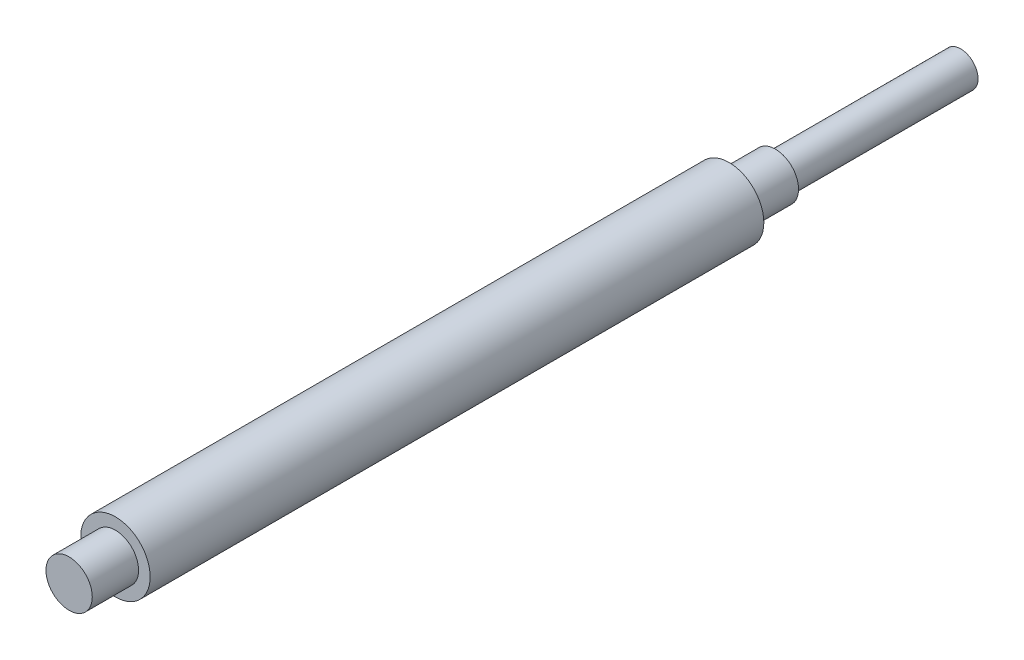
ISO-10303-21;
HEADER;
FILE_DESCRIPTION(('STEP AP214'),'2;1');
FILE_NAME('part.step','',(''),(''),'','','');
FILE_SCHEMA(('AUTOMOTIVE_DESIGN { 1 0 10303 214 1 1 1 1 }'));
ENDSEC;
DATA;
#1=APPLICATION_CONTEXT('core data for automotive mechanical design processes');
#2=APPLICATION_PROTOCOL_DEFINITION('international standard','automotive_design',2000,#1);
#3=PRODUCT_CONTEXT('',#1,'mechanical');
#4=PRODUCT('Part','Part','',(#3));
#5=PRODUCT_RELATED_PRODUCT_CATEGORY('part','',(#4));
#6=PRODUCT_DEFINITION_FORMATION('','',#4);
#7=PRODUCT_DEFINITION_CONTEXT('part definition',#1,'design');
#8=PRODUCT_DEFINITION('design','',#6,#7);
#9=PRODUCT_DEFINITION_SHAPE('','',#8);
#10=(LENGTH_UNIT() NAMED_UNIT(*) SI_UNIT(.MILLI.,.METRE.));
#11=(NAMED_UNIT(*) PLANE_ANGLE_UNIT() SI_UNIT($,.RADIAN.));
#12=(NAMED_UNIT(*) SI_UNIT($,.STERADIAN.) SOLID_ANGLE_UNIT());
#13=UNCERTAINTY_MEASURE_WITH_UNIT(LENGTH_MEASURE(1.E-05),#10,'distance_accuracy_value','');
#14=(GEOMETRIC_REPRESENTATION_CONTEXT(3) GLOBAL_UNCERTAINTY_ASSIGNED_CONTEXT((#13)) GLOBAL_UNIT_ASSIGNED_CONTEXT((#10,
#11,#12)) REPRESENTATION_CONTEXT('',''));
#15=CARTESIAN_POINT('',(0.,0.,0.));
#16=DIRECTION('',(0.,0.,1.));
#17=DIRECTION('',(1.,0.,0.));
#18=AXIS2_PLACEMENT_3D('',#15,#16,#17);
#19=CARTESIAN_POINT('',(0.,0.,77.));
#20=DIRECTION('',(0.,0.,-1.));
#21=DIRECTION('',(-1.,0.,0.));
#22=AXIS2_PLACEMENT_3D('',#19,#20,#21);
#23=CYLINDRICAL_SURFACE('',#22,3.);
#24=CARTESIAN_POINT('',(0.,0.,20.));
#25=DIRECTION('',(0.,0.,1.));
#26=DIRECTION('',(1.,0.,0.));
#27=AXIS2_PLACEMENT_3D('',#24,#25,#26);
#28=CIRCLE('',#27,3.);
#29=CARTESIAN_POINT('',(3.,0.,20.));
#30=VERTEX_POINT('',#29);
#31=EDGE_CURVE('E60',#30,#30,#28,.F.);
#32=ORIENTED_EDGE('',*,*,#31,.F.);
#33=EDGE_LOOP('',(#32));
#34=FACE_BOUND('',#33,.T.);
#35=CARTESIAN_POINT('',(0.,0.,73.));
#36=DIRECTION('',(0.,0.,1.));
#37=DIRECTION('',(1.,0.,0.));
#38=AXIS2_PLACEMENT_3D('',#35,#36,#37);
#39=CIRCLE('',#38,3.);
#40=CARTESIAN_POINT('',(3.,0.,73.));
#41=VERTEX_POINT('',#40);
#42=EDGE_CURVE('E12',#41,#41,#39,.T.);
#43=ORIENTED_EDGE('',*,*,#42,.F.);
#44=EDGE_LOOP('',(#43));
#45=FACE_BOUND('',#44,.T.);
#46=ADVANCED_FACE('F40',(#34,#45),#23,.T.);
#47=CARTESIAN_POINT('',(0.,0.,73.));
#48=DIRECTION('',(0.,0.,1.));
#49=DIRECTION('',(1.,0.,0.));
#50=AXIS2_PLACEMENT_3D('',#47,#48,#49);
#51=PLANE('',#50);
#52=CARTESIAN_POINT('',(0.,0.,73.));
#53=DIRECTION('',(0.,0.,1.));
#54=DIRECTION('',(1.,0.,0.));
#55=AXIS2_PLACEMENT_3D('',#52,#53,#54);
#56=CIRCLE('',#55,2.);
#57=CARTESIAN_POINT('',(2.,0.,73.));
#58=VERTEX_POINT('',#57);
#59=EDGE_CURVE('E48',#58,#58,#56,.T.);
#60=ORIENTED_EDGE('',*,*,#59,.F.);
#61=EDGE_LOOP('',(#60));
#62=FACE_BOUND('',#61,.T.);
#63=ORIENTED_EDGE('',*,*,#42,.T.);
#64=EDGE_LOOP('',(#63));
#65=FACE_BOUND('',#64,.T.);
#66=ADVANCED_FACE('F95',(#62,#65),#51,.T.);
#67=CARTESIAN_POINT('',(0.,0.,73.));
#68=DIRECTION('',(0.,0.,1.));
#69=DIRECTION('',(1.,0.,0.));
#70=AXIS2_PLACEMENT_3D('',#67,#68,#69);
#71=CYLINDRICAL_SURFACE('',#70,2.);
#72=ORIENTED_EDGE('',*,*,#59,.T.);
#73=EDGE_LOOP('',(#72));
#74=FACE_BOUND('',#73,.T.);
#75=CARTESIAN_POINT('',(0.,0.,77.));
#76=DIRECTION('',(0.,0.,1.));
#77=DIRECTION('',(1.,0.,0.));
#78=AXIS2_PLACEMENT_3D('',#75,#76,#77);
#79=CIRCLE('',#78,2.);
#80=CARTESIAN_POINT('',(2.,0.,77.));
#81=VERTEX_POINT('',#80);
#82=EDGE_CURVE('E53',#81,#81,#79,.T.);
#83=ORIENTED_EDGE('',*,*,#82,.F.);
#84=EDGE_LOOP('',(#83));
#85=FACE_BOUND('',#84,.T.);
#86=ADVANCED_FACE('F100',(#74,#85),#71,.T.);
#87=CARTESIAN_POINT('',(0.,0.,77.));
#88=DIRECTION('',(0.,0.,1.));
#89=DIRECTION('',(1.,0.,0.));
#90=AXIS2_PLACEMENT_3D('',#87,#88,#89);
#91=PLANE('',#90);
#92=ORIENTED_EDGE('',*,*,#82,.T.);
#93=EDGE_LOOP('',(#92));
#94=FACE_BOUND('',#93,.T.);
#95=ADVANCED_FACE('F113',(#94),#91,.T.);
#96=CARTESIAN_POINT('',(0.,0.,81.4852813742386));
#97=DIRECTION('',(0.,0.,-1.));
#98=DIRECTION('',(-1.,0.,0.));
#99=AXIS2_PLACEMENT_3D('',#96,#97,#98);
#100=CYLINDRICAL_SURFACE('',#99,2.);
#101=CARTESIAN_POINT('',(0.,0.,16.));
#102=DIRECTION('',(0.,0.,1.));
#103=DIRECTION('',(1.,0.,0.));
#104=AXIS2_PLACEMENT_3D('',#101,#102,#103);
#105=CIRCLE('',#104,2.);
#106=CARTESIAN_POINT('',(2.,0.,16.));
#107=VERTEX_POINT('',#106);
#108=EDGE_CURVE('E43',#107,#107,#105,.F.);
#109=ORIENTED_EDGE('',*,*,#108,.F.);
#110=EDGE_LOOP('',(#109));
#111=FACE_BOUND('',#110,.T.);
#112=CARTESIAN_POINT('',(0.,0.,20.));
#113=DIRECTION('',(0.,0.,1.));
#114=DIRECTION('',(1.,0.,0.));
#115=AXIS2_PLACEMENT_3D('',#112,#113,#114);
#116=CIRCLE('',#115,2.);
#117=CARTESIAN_POINT('',(2.,0.,20.));
#118=VERTEX_POINT('',#117);
#119=EDGE_CURVE('E58',#118,#118,#116,.F.);
#120=ORIENTED_EDGE('',*,*,#119,.T.);
#121=EDGE_LOOP('',(#120));
#122=FACE_BOUND('',#121,.T.);
#123=ADVANCED_FACE('F108',(#111,#122),#100,.T.);
#124=CARTESIAN_POINT('',(0.,0.,20.));
#125=DIRECTION('',(0.,0.,1.));
#126=DIRECTION('',(1.,0.,0.));
#127=AXIS2_PLACEMENT_3D('',#124,#125,#126);
#128=PLANE('',#127);
#129=ORIENTED_EDGE('',*,*,#31,.T.);
#130=EDGE_LOOP('',(#129));
#131=FACE_BOUND('',#130,.T.);
#132=ORIENTED_EDGE('',*,*,#119,.F.);
#133=EDGE_LOOP('',(#132));
#134=FACE_BOUND('',#133,.T.);
#135=ADVANCED_FACE('F82',(#131,#134),#128,.F.);
#136=CARTESIAN_POINT('',(0.,0.,27.0710678118655));
#137=DIRECTION('',(0.,0.,-1.));
#138=DIRECTION('',(-1.,0.,0.));
#139=AXIS2_PLACEMENT_3D('',#136,#137,#138);
#140=CYLINDRICAL_SURFACE('',#139,1.5);
#141=CARTESIAN_POINT('',(0.,0.,0.));
#142=DIRECTION('',(0.,0.,-1.));
#143=DIRECTION('',(-1.,0.,0.));
#144=AXIS2_PLACEMENT_3D('',#141,#142,#143);
#145=CIRCLE('',#144,1.5);
#146=CARTESIAN_POINT('',(-1.5,0.,0.));
#147=VERTEX_POINT('',#146);
#148=EDGE_CURVE('E71',#147,#147,#145,.T.);
#149=CARTESIAN_POINT('',(0.,0.,16.));
#150=DIRECTION('',(0.,0.,1.));
#151=DIRECTION('',(1.,0.,0.));
#152=AXIS2_PLACEMENT_3D('',#149,#150,#151);
#153=CIRCLE('',#152,1.5);
#154=CARTESIAN_POINT('',(-1.5,0.,16.));
#155=VERTEX_POINT('',#154);
#156=EDGE_CURVE('E67',#155,#155,#153,.F.);
#157=CARTESIAN_POINT('',(-1.5,0.,0.));
#158=CARTESIAN_POINT('',(-1.5,0.,0.16666666666667));
#159=CARTESIAN_POINT('',(-1.5,0.,0.333333333333337));
#160=CARTESIAN_POINT('',(-1.5,0.,0.666666666666671));
#161=CARTESIAN_POINT('',(-1.5,0.,0.833333333333338));
#162=CARTESIAN_POINT('',(-1.5,0.,1.16666666666667));
#163=CARTESIAN_POINT('',(-1.5,0.,1.33333333333334));
#164=CARTESIAN_POINT('',(-1.5,0.,1.66666666666667));
#165=CARTESIAN_POINT('',(-1.5,0.,1.83333333333334));
#166=CARTESIAN_POINT('',(-1.5,0.,2.16666666666667));
#167=CARTESIAN_POINT('',(-1.5,0.,2.33333333333334));
#168=CARTESIAN_POINT('',(-1.5,0.,2.66666666666667));
#169=CARTESIAN_POINT('',(-1.5,0.,2.83333333333334));
#170=CARTESIAN_POINT('',(-1.5,0.,3.16666666666667));
#171=CARTESIAN_POINT('',(-1.5,0.,3.33333333333334));
#172=CARTESIAN_POINT('',(-1.5,0.,3.66666666666667));
#173=CARTESIAN_POINT('',(-1.5,0.,3.83333333333333));
#174=CARTESIAN_POINT('',(-1.5,0.,4.16666666666667));
#175=CARTESIAN_POINT('',(-1.5,0.,4.33333333333333));
#176=CARTESIAN_POINT('',(-1.5,0.,4.66666666666667));
#177=CARTESIAN_POINT('',(-1.5,0.,4.83333333333333));
#178=CARTESIAN_POINT('',(-1.5,0.,5.16666666666667));
#179=CARTESIAN_POINT('',(-1.5,0.,5.33333333333333));
#180=CARTESIAN_POINT('',(-1.5,0.,5.66666666666667));
#181=CARTESIAN_POINT('',(-1.5,0.,5.83333333333334));
#182=CARTESIAN_POINT('',(-1.5,0.,6.16666666666667));
#183=CARTESIAN_POINT('',(-1.5,0.,6.33333333333334));
#184=CARTESIAN_POINT('',(-1.5,0.,6.66666666666667));
#185=CARTESIAN_POINT('',(-1.5,0.,6.83333333333334));
#186=CARTESIAN_POINT('',(-1.5,0.,7.16666666666667));
#187=CARTESIAN_POINT('',(-1.5,0.,7.33333333333333));
#188=CARTESIAN_POINT('',(-1.5,0.,7.66666666666667));
#189=CARTESIAN_POINT('',(-1.5,0.,7.83333333333333));
#190=CARTESIAN_POINT('',(-1.5,0.,8.16666666666667));
#191=CARTESIAN_POINT('',(-1.5,0.,8.33333333333333));
#192=CARTESIAN_POINT('',(-1.5,0.,8.66666666666667));
#193=CARTESIAN_POINT('',(-1.5,0.,8.83333333333333));
#194=CARTESIAN_POINT('',(-1.5,0.,9.16666666666666));
#195=CARTESIAN_POINT('',(-1.5,0.,9.33333333333333));
#196=CARTESIAN_POINT('',(-1.5,0.,9.66666666666667));
#197=CARTESIAN_POINT('',(-1.5,0.,9.83333333333333));
#198=CARTESIAN_POINT('',(-1.5,0.,10.1666666666667));
#199=CARTESIAN_POINT('',(-1.5,0.,10.3333333333333));
#200=CARTESIAN_POINT('',(-1.5,0.,10.6666666666667));
#201=CARTESIAN_POINT('',(-1.5,0.,10.8333333333333));
#202=CARTESIAN_POINT('',(-1.5,0.,11.1666666666667));
#203=CARTESIAN_POINT('',(-1.5,0.,11.3333333333333));
#204=CARTESIAN_POINT('',(-1.5,0.,11.6666666666667));
#205=CARTESIAN_POINT('',(-1.5,0.,11.8333333333333));
#206=CARTESIAN_POINT('',(-1.5,0.,12.1666666666667));
#207=CARTESIAN_POINT('',(-1.5,0.,12.3333333333333));
#208=CARTESIAN_POINT('',(-1.5,0.,12.6666666666667));
#209=CARTESIAN_POINT('',(-1.5,0.,12.8333333333333));
#210=CARTESIAN_POINT('',(-1.5,0.,13.1666666666667));
#211=CARTESIAN_POINT('',(-1.5,0.,13.3333333333333));
#212=CARTESIAN_POINT('',(-1.5,0.,13.6666666666667));
#213=CARTESIAN_POINT('',(-1.5,0.,13.8333333333333));
#214=CARTESIAN_POINT('',(-1.5,0.,14.1666666666667));
#215=CARTESIAN_POINT('',(-1.5,0.,14.3333333333333));
#216=CARTESIAN_POINT('',(-1.5,0.,14.6666666666667));
#217=CARTESIAN_POINT('',(-1.5,0.,14.8333333333333));
#218=CARTESIAN_POINT('',(-1.5,0.,15.1666666666667));
#219=CARTESIAN_POINT('',(-1.5,0.,15.3333333333333));
#220=CARTESIAN_POINT('',(-1.5,0.,15.6666666666667));
#221=CARTESIAN_POINT('',(-1.5,0.,15.8333333333333));
#222=CARTESIAN_POINT('',(-1.5,0.,16.));
#223=B_SPLINE_CURVE_WITH_KNOTS('',3,(#157,#158,#159,#160,#161,#162,#163,#164,#165,#166,#167,
#168,#169,#170,#171,#172,#173,#174,#175,#176,#177,#178,#179,#180,#181,#182,#183,#184,#185,#186,
#187,#188,#189,#190,#191,#192,#193,#194,#195,#196,#197,#198,#199,#200,#201,#202,#203,#204,#205,
#206,#207,#208,#209,#210,#211,#212,#213,#214,#215,#216,#217,#218,#219,#220,#221,#222),
.UNSPECIFIED.,.F.,.F.,(4,2,2,2,2,2,2,2,2,2,2,2,2,2,2,2,2,2,2,2,2,2,2,2,2,2,2,2,2,2,2,2,4),(0.,
0.5,1.,1.5,2.,2.5,3.,3.5,4.,4.5,5.,5.5,6.,6.5,7.,7.5,8.,8.5,8.99999999999999,9.49999999999999,
9.99999999999999,10.5,11.,11.5,12.,12.5,13.,13.5,14.,14.5,15.,15.5,16.),.UNSPECIFIED.);
#224=EDGE_CURVE('BSEAM78',#147,#155,#223,.T.);
#225=ORIENTED_EDGE('',*,*,#148,.F.);
#226=ORIENTED_EDGE('',*,*,#156,.T.);
#227=ORIENTED_EDGE('',*,*,#224,.T.);
#228=ORIENTED_EDGE('',*,*,#224,.F.);
#229=EDGE_LOOP('',(#225,#227,#226,#228));
#230=FACE_BOUND('',#229,.T.);
#231=ADVANCED_FACE('F78',(#230),#140,.T.);
#232=CARTESIAN_POINT('',(0.,0.,16.));
#233=DIRECTION('',(0.,0.,1.));
#234=DIRECTION('',(1.,0.,0.));
#235=AXIS2_PLACEMENT_3D('',#232,#233,#234);
#236=PLANE('',#235);
#237=ORIENTED_EDGE('',*,*,#108,.T.);
#238=EDGE_LOOP('',(#237));
#239=FACE_BOUND('',#238,.T.);
#240=ORIENTED_EDGE('',*,*,#156,.F.);
#241=EDGE_LOOP('',(#240));
#242=FACE_BOUND('',#241,.T.);
#243=ADVANCED_FACE('F81',(#239,#242),#236,.F.);
#244=CARTESIAN_POINT('',(0.,0.,0.));
#245=DIRECTION('',(0.,0.,1.));
#246=DIRECTION('',(1.,0.,0.));
#247=AXIS2_PLACEMENT_3D('',#244,#245,#246);
#248=PLANE('',#247);
#249=ORIENTED_EDGE('',*,*,#148,.T.);
#250=EDGE_LOOP('',(#249));
#251=FACE_BOUND('',#250,.T.);
#252=ADVANCED_FACE('F76',(#251),#248,.F.);
#253=CLOSED_SHELL('',(#46,#66,#86,#95,#123,#135,#231,#243,#252));
#254=MANIFOLD_SOLID_BREP('B2',#253);
#255=ADVANCED_BREP_SHAPE_REPRESENTATION('',(#18,#254),#14);
#256=SHAPE_DEFINITION_REPRESENTATION(#9,#255);
ENDSEC;
END-ISO-10303-21;
